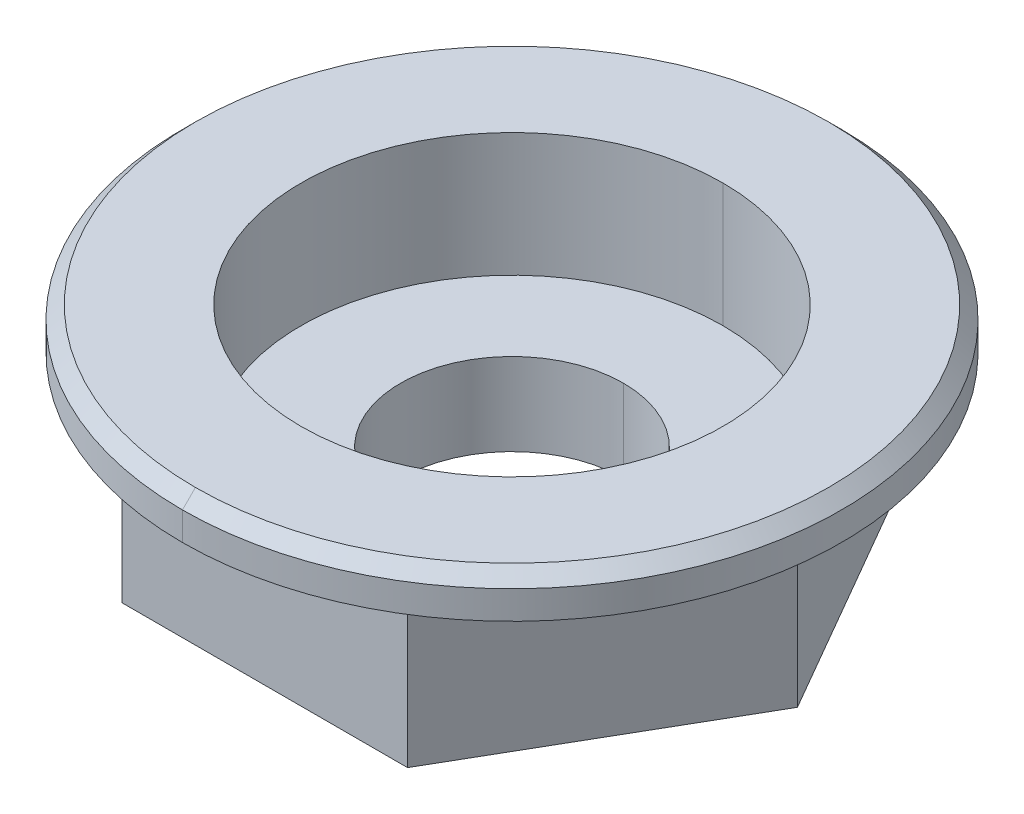
ISO-10303-21;
HEADER;
FILE_DESCRIPTION(('STEP AP214'),'2;1');
FILE_NAME('part.step','',(''),(''),'','','');
FILE_SCHEMA(('AUTOMOTIVE_DESIGN { 1 0 10303 214 1 1 1 1 }'));
ENDSEC;
DATA;
#1=APPLICATION_CONTEXT('core data for automotive mechanical design processes');
#2=APPLICATION_PROTOCOL_DEFINITION('international standard','automotive_design',2000,#1);
#3=PRODUCT_CONTEXT('',#1,'mechanical');
#4=PRODUCT('Part','Part','',(#3));
#5=PRODUCT_RELATED_PRODUCT_CATEGORY('part','',(#4));
#6=PRODUCT_DEFINITION_FORMATION('','',#4);
#7=PRODUCT_DEFINITION_CONTEXT('part definition',#1,'design');
#8=PRODUCT_DEFINITION('design','',#6,#7);
#9=PRODUCT_DEFINITION_SHAPE('','',#8);
#10=(LENGTH_UNIT() NAMED_UNIT(*) SI_UNIT(.MILLI.,.METRE.));
#11=(NAMED_UNIT(*) PLANE_ANGLE_UNIT() SI_UNIT($,.RADIAN.));
#12=(NAMED_UNIT(*) SI_UNIT($,.STERADIAN.) SOLID_ANGLE_UNIT());
#13=UNCERTAINTY_MEASURE_WITH_UNIT(LENGTH_MEASURE(1.E-05),#10,'distance_accuracy_value','');
#14=(GEOMETRIC_REPRESENTATION_CONTEXT(3) GLOBAL_UNCERTAINTY_ASSIGNED_CONTEXT((#13)) GLOBAL_UNIT_ASSIGNED_CONTEXT((#10,
#11,#12)) REPRESENTATION_CONTEXT('',''));
#15=CARTESIAN_POINT('',(0.,0.,0.));
#16=DIRECTION('',(0.,0.,1.));
#17=DIRECTION('',(1.,0.,0.));
#18=AXIS2_PLACEMENT_3D('',#15,#16,#17);
#19=CARTESIAN_POINT('',(0.,3.96875,0.));
#20=DIRECTION('',(0.,-1.,0.));
#21=DIRECTION('',(0.,0.,-1.));
#22=AXIS2_PLACEMENT_3D('',#19,#20,#21);
#23=CONICAL_SURFACE('',#22,6.1,0.785398163397446);
#24=DIRECTION('',(0.,-0.707106781186549,0.707106781186546));
#25=VECTOR('',#24,1.);
#26=CARTESIAN_POINT('',(0.,3.96875,6.1));
#27=LINE('',#26,#25);
#28=CARTESIAN_POINT('',(0.,3.96875,6.1));
#29=VERTEX_POINT('',#28);
#30=CARTESIAN_POINT('',(0.,3.71875,6.35));
#31=VERTEX_POINT('',#30);
#32=EDGE_CURVE('E206',#29,#31,#27,.T.);
#33=ORIENTED_EDGE('',*,*,#32,.F.);
#34=CARTESIAN_POINT('',(0.,3.96875,0.));
#35=DIRECTION('',(0.,1.,0.));
#36=DIRECTION('',(0.,0.,1.));
#37=AXIS2_PLACEMENT_3D('',#34,#35,#36);
#38=CIRCLE('',#37,6.1);
#39=CARTESIAN_POINT('',(0.,3.96875,-6.1));
#40=VERTEX_POINT('',#39);
#41=EDGE_CURVE('E228',#40,#29,#38,.T.);
#42=ORIENTED_EDGE('',*,*,#41,.F.);
#43=DIRECTION('',(0.,-0.707106781186549,-0.707106781186546));
#44=VECTOR('',#43,1.);
#45=CARTESIAN_POINT('',(0.,3.96875,-6.1));
#46=LINE('',#45,#44);
#47=CARTESIAN_POINT('',(0.,3.71875,-6.35));
#48=VERTEX_POINT('',#47);
#49=EDGE_CURVE('E244',#40,#48,#46,.T.);
#50=ORIENTED_EDGE('',*,*,#49,.T.);
#51=CARTESIAN_POINT('',(0.,3.71875,0.));
#52=DIRECTION('',(0.,-1.,0.));
#53=DIRECTION('',(0.,0.,1.));
#54=AXIS2_PLACEMENT_3D('',#51,#52,#53);
#55=CIRCLE('',#54,6.35);
#56=EDGE_CURVE('E247',#31,#48,#55,.T.);
#57=ORIENTED_EDGE('',*,*,#56,.F.);
#58=EDGE_LOOP('',(#33,#42,#50,#57));
#59=FACE_BOUND('',#58,.T.);
#60=ADVANCED_FACE('F16',(#59),#23,.T.);
#61=CARTESIAN_POINT('',(0.,0.,0.));
#62=DIRECTION('',(0.,1.,0.));
#63=DIRECTION('',(0.,0.,1.));
#64=AXIS2_PLACEMENT_3D('',#61,#62,#63);
#65=CYLINDRICAL_SURFACE('',#64,2.1463);
#66=DIRECTION('',(0.,1.,0.));
#67=VECTOR('',#66,1.);
#68=CARTESIAN_POINT('',(0.,0.,-2.1463));
#69=LINE('',#68,#67);
#70=CARTESIAN_POINT('',(0.,0.,-2.1463));
#71=VERTEX_POINT('',#70);
#72=CARTESIAN_POINT('',(0.,1.5875,-2.1463));
#73=VERTEX_POINT('',#72);
#74=EDGE_CURVE('E215',#71,#73,#69,.T.);
#75=ORIENTED_EDGE('',*,*,#74,.F.);
#76=CARTESIAN_POINT('',(0.,0.,0.));
#77=DIRECTION('',(0.,1.,0.));
#78=DIRECTION('',(0.,0.,1.));
#79=AXIS2_PLACEMENT_3D('',#76,#77,#78);
#80=CIRCLE('',#79,2.1463);
#81=CARTESIAN_POINT('',(0.,0.,2.1463));
#82=VERTEX_POINT('',#81);
#83=EDGE_CURVE('E216',#82,#71,#80,.T.);
#84=ORIENTED_EDGE('',*,*,#83,.F.);
#85=DIRECTION('',(0.,1.,0.));
#86=VECTOR('',#85,1.);
#87=CARTESIAN_POINT('',(0.,0.,2.1463));
#88=LINE('',#87,#86);
#89=CARTESIAN_POINT('',(0.,1.5875,2.1463));
#90=VERTEX_POINT('',#89);
#91=EDGE_CURVE('E201',#82,#90,#88,.T.);
#92=ORIENTED_EDGE('',*,*,#91,.T.);
#93=CARTESIAN_POINT('',(0.,1.5875,0.));
#94=DIRECTION('',(0.,1.,0.));
#95=DIRECTION('',(0.,0.,1.));
#96=AXIS2_PLACEMENT_3D('',#93,#94,#95);
#97=CIRCLE('',#96,2.1463);
#98=EDGE_CURVE('E11',#90,#73,#97,.T.);
#99=ORIENTED_EDGE('',*,*,#98,.T.);
#100=EDGE_LOOP('',(#75,#84,#92,#99));
#101=FACE_BOUND('',#100,.T.);
#102=ADVANCED_FACE('F436',(#101),#65,.F.);
#103=CARTESIAN_POINT('',(0.,1.5875,0.));
#104=DIRECTION('',(0.,1.,0.));
#105=DIRECTION('',(1.,0.,0.));
#106=AXIS2_PLACEMENT_3D('',#103,#104,#105);
#107=PLANE('',#106);
#108=ORIENTED_EDGE('',*,*,#98,.F.);
#109=CARTESIAN_POINT('',(0.,1.5875,0.));
#110=DIRECTION('',(0.,1.,0.));
#111=DIRECTION('',(0.,0.,1.));
#112=AXIS2_PLACEMENT_3D('',#109,#110,#111);
#113=CIRCLE('',#112,2.1463);
#114=EDGE_CURVE('E205',#73,#90,#113,.T.);
#115=ORIENTED_EDGE('',*,*,#114,.F.);
#116=EDGE_LOOP('',(#108,#115));
#117=FACE_BOUND('',#116,.T.);
#118=CARTESIAN_POINT('',(0.,1.5875,0.));
#119=DIRECTION('',(0.,-1.,0.));
#120=DIRECTION('',(0.,0.,1.));
#121=AXIS2_PLACEMENT_3D('',#118,#119,#120);
#122=CIRCLE('',#121,4.064);
#123=CARTESIAN_POINT('',(0.,1.5875,4.064));
#124=VERTEX_POINT('',#123);
#125=CARTESIAN_POINT('',(0.,1.5875,-4.064));
#126=VERTEX_POINT('',#125);
#127=EDGE_CURVE('E204',#124,#126,#122,.T.);
#128=ORIENTED_EDGE('',*,*,#127,.F.);
#129=CARTESIAN_POINT('',(0.,1.5875,0.));
#130=DIRECTION('',(0.,-1.,0.));
#131=DIRECTION('',(0.,0.,1.));
#132=AXIS2_PLACEMENT_3D('',#129,#130,#131);
#133=CIRCLE('',#132,4.064);
#134=EDGE_CURVE('E27',#126,#124,#133,.T.);
#135=ORIENTED_EDGE('',*,*,#134,.F.);
#136=EDGE_LOOP('',(#128,#135));
#137=FACE_BOUND('',#136,.T.);
#138=ADVANCED_FACE('F18',(#117,#137),#107,.T.);
#139=CARTESIAN_POINT('',(0.,-11.4947278349685,0.));
#140=DIRECTION('',(0.,1.,0.));
#141=DIRECTION('',(0.,0.,1.));
#142=AXIS2_PLACEMENT_3D('',#139,#140,#141);
#143=CYLINDRICAL_SURFACE('',#142,4.064);
#144=DIRECTION('',(0.,1.,0.));
#145=VECTOR('',#144,1.);
#146=CARTESIAN_POINT('',(0.,-11.4947278349685,-4.064));
#147=LINE('',#146,#145);
#148=CARTESIAN_POINT('',(0.,3.96875,-4.064));
#149=VERTEX_POINT('',#148);
#150=EDGE_CURVE('E271',#126,#149,#147,.T.);
#151=ORIENTED_EDGE('',*,*,#150,.F.);
#152=ORIENTED_EDGE('',*,*,#134,.T.);
#153=DIRECTION('',(0.,1.,0.));
#154=VECTOR('',#153,1.);
#155=CARTESIAN_POINT('',(0.,-11.4947278349685,4.064));
#156=LINE('',#155,#154);
#157=CARTESIAN_POINT('',(0.,3.96875,4.064));
#158=VERTEX_POINT('',#157);
#159=EDGE_CURVE('E255',#124,#158,#156,.T.);
#160=ORIENTED_EDGE('',*,*,#159,.T.);
#161=CARTESIAN_POINT('',(0.,3.96875,0.));
#162=DIRECTION('',(0.,1.,0.));
#163=DIRECTION('',(0.,0.,1.));
#164=AXIS2_PLACEMENT_3D('',#161,#162,#163);
#165=CIRCLE('',#164,4.064);
#166=EDGE_CURVE('E225',#158,#149,#165,.T.);
#167=ORIENTED_EDGE('',*,*,#166,.T.);
#168=EDGE_LOOP('',(#151,#152,#160,#167));
#169=FACE_BOUND('',#168,.T.);
#170=ADVANCED_FACE('F283',(#169),#143,.F.);
#171=CARTESIAN_POINT('',(0.,3.96875,0.));
#172=DIRECTION('',(0.,1.,0.));
#173=DIRECTION('',(1.,0.,0.));
#174=AXIS2_PLACEMENT_3D('',#171,#172,#173);
#175=PLANE('',#174);
#176=ORIENTED_EDGE('',*,*,#166,.F.);
#177=CARTESIAN_POINT('',(0.,3.96875,0.));
#178=DIRECTION('',(0.,1.,0.));
#179=DIRECTION('',(0.,0.,1.));
#180=AXIS2_PLACEMENT_3D('',#177,#178,#179);
#181=CIRCLE('',#180,4.064);
#182=EDGE_CURVE('E259',#149,#158,#181,.T.);
#183=ORIENTED_EDGE('',*,*,#182,.F.);
#184=EDGE_LOOP('',(#176,#183));
#185=FACE_BOUND('',#184,.T.);
#186=ORIENTED_EDGE('',*,*,#41,.T.);
#187=CARTESIAN_POINT('',(0.,3.96875,0.));
#188=DIRECTION('',(0.,1.,0.));
#189=DIRECTION('',(0.,0.,1.));
#190=AXIS2_PLACEMENT_3D('',#187,#188,#189);
#191=CIRCLE('',#190,6.1);
#192=EDGE_CURVE('E211',#29,#40,#191,.T.);
#193=ORIENTED_EDGE('',*,*,#192,.T.);
#194=EDGE_LOOP('',(#186,#193));
#195=FACE_BOUND('',#194,.T.);
#196=ADVANCED_FACE('F373',(#185,#195),#175,.T.);
#197=CARTESIAN_POINT('',(0.,3.96875,0.));
#198=DIRECTION('',(0.,-1.,0.));
#199=DIRECTION('',(0.,0.,-1.));
#200=AXIS2_PLACEMENT_3D('',#197,#198,#199);
#201=CYLINDRICAL_SURFACE('',#200,6.35);
#202=DIRECTION('',(0.,-1.,0.));
#203=VECTOR('',#202,1.);
#204=CARTESIAN_POINT('',(0.,3.96875,6.35));
#205=LINE('',#204,#203);
#206=CARTESIAN_POINT('',(0.,3.175,6.35));
#207=VERTEX_POINT('',#206);
#208=EDGE_CURVE('E199',#31,#207,#205,.T.);
#209=ORIENTED_EDGE('',*,*,#208,.F.);
#210=ORIENTED_EDGE('',*,*,#56,.T.);
#211=DIRECTION('',(0.,-1.,0.));
#212=VECTOR('',#211,1.);
#213=CARTESIAN_POINT('',(0.,3.96875,-6.35));
#214=LINE('',#213,#212);
#215=CARTESIAN_POINT('',(0.,3.175,-6.35));
#216=VERTEX_POINT('',#215);
#217=EDGE_CURVE('E188',#48,#216,#214,.T.);
#218=ORIENTED_EDGE('',*,*,#217,.T.);
#219=CARTESIAN_POINT('',(0.,3.175,0.));
#220=DIRECTION('',(0.,1.,0.));
#221=DIRECTION('',(0.,0.,1.));
#222=AXIS2_PLACEMENT_3D('',#219,#220,#221);
#223=CIRCLE('',#222,6.35);
#224=EDGE_CURVE('E220',#216,#207,#223,.T.);
#225=ORIENTED_EDGE('',*,*,#224,.T.);
#226=EDGE_LOOP('',(#209,#210,#218,#225));
#227=FACE_BOUND('',#226,.T.);
#228=ADVANCED_FACE('F367',(#227),#201,.T.);
#229=CARTESIAN_POINT('',(0.,3.175,0.));
#230=DIRECTION('',(0.,1.,0.));
#231=DIRECTION('',(1.,0.,0.));
#232=AXIS2_PLACEMENT_3D('',#229,#230,#231);
#233=PLANE('',#232);
#234=DIRECTION('',(1.,0.,0.));
#235=VECTOR('',#234,1.);
#236=CARTESIAN_POINT('',(-2.74963065701554,3.175,4.7625));
#237=LINE('',#236,#235);
#238=CARTESIAN_POINT('',(-2.74963065701554,3.175,4.7625));
#239=VERTEX_POINT('',#238);
#240=CARTESIAN_POINT('',(2.74963065701564,3.175,4.7625));
#241=VERTEX_POINT('',#240);
#242=EDGE_CURVE('E42',#239,#241,#237,.T.);
#243=ORIENTED_EDGE('',*,*,#242,.T.);
#244=DIRECTION('',(0.5,0.,-0.866025403784442));
#245=VECTOR('',#244,1.);
#246=CARTESIAN_POINT('',(2.74963065701564,3.175,4.7625));
#247=LINE('',#246,#245);
#248=CARTESIAN_POINT('',(5.49926131403117,3.175,0.));
#249=VERTEX_POINT('',#248);
#250=EDGE_CURVE('E184',#241,#249,#247,.T.);
#251=ORIENTED_EDGE('',*,*,#250,.T.);
#252=DIRECTION('',(-0.5,0.,-0.866025403784438));
#253=VECTOR('',#252,1.);
#254=CARTESIAN_POINT('',(5.49926131403117,3.175,0.));
#255=LINE('',#254,#253);
#256=CARTESIAN_POINT('',(2.74963065701558,3.175,-4.7625));
#257=VERTEX_POINT('',#256);
#258=EDGE_CURVE('E179',#249,#257,#255,.T.);
#259=ORIENTED_EDGE('',*,*,#258,.T.);
#260=DIRECTION('',(-1.,0.,0.));
#261=VECTOR('',#260,1.);
#262=CARTESIAN_POINT('',(2.74963065701558,3.175,-4.7625));
#263=LINE('',#262,#261);
#264=CARTESIAN_POINT('',(-2.7496306570156,3.175,-4.7625));
#265=VERTEX_POINT('',#264);
#266=EDGE_CURVE('E130',#257,#265,#263,.T.);
#267=ORIENTED_EDGE('',*,*,#266,.T.);
#268=DIRECTION('',(-0.5,0.,0.866025403784442));
#269=VECTOR('',#268,1.);
#270=CARTESIAN_POINT('',(-2.7496306570156,3.175,-4.7625));
#271=LINE('',#270,#269);
#272=CARTESIAN_POINT('',(-5.49926131403117,3.175,0.));
#273=VERTEX_POINT('',#272);
#274=EDGE_CURVE('E145',#265,#273,#271,.T.);
#275=ORIENTED_EDGE('',*,*,#274,.T.);
#276=DIRECTION('',(0.500000000000007,0.,0.866025403784435));
#277=VECTOR('',#276,1.);
#278=CARTESIAN_POINT('',(-5.49926131403117,3.175,0.));
#279=LINE('',#278,#277);
#280=EDGE_CURVE('E224',#273,#239,#279,.T.);
#281=ORIENTED_EDGE('',*,*,#280,.T.);
#282=EDGE_LOOP('',(#243,#251,#259,#267,#275,#281));
#283=FACE_BOUND('',#282,.T.);
#284=ORIENTED_EDGE('',*,*,#224,.F.);
#285=CARTESIAN_POINT('',(0.,3.175,0.));
#286=DIRECTION('',(0.,1.,0.));
#287=DIRECTION('',(0.,0.,1.));
#288=AXIS2_PLACEMENT_3D('',#285,#286,#287);
#289=CIRCLE('',#288,6.35);
#290=EDGE_CURVE('E195',#207,#216,#289,.T.);
#291=ORIENTED_EDGE('',*,*,#290,.F.);
#292=EDGE_LOOP('',(#284,#291));
#293=FACE_BOUND('',#292,.T.);
#294=ADVANCED_FACE('F372',(#283,#293),#233,.F.);
#295=CARTESIAN_POINT('',(0.,0.,0.));
#296=DIRECTION('',(0.,1.,0.));
#297=DIRECTION('',(1.,0.,0.));
#298=AXIS2_PLACEMENT_3D('',#295,#296,#297);
#299=PLANE('',#298);
#300=ORIENTED_EDGE('',*,*,#83,.T.);
#301=CARTESIAN_POINT('',(0.,0.,0.));
#302=DIRECTION('',(0.,1.,0.));
#303=DIRECTION('',(0.,0.,1.));
#304=AXIS2_PLACEMENT_3D('',#301,#302,#303);
#305=CIRCLE('',#304,2.1463);
#306=EDGE_CURVE('E240',#71,#82,#305,.T.);
#307=ORIENTED_EDGE('',*,*,#306,.T.);
#308=EDGE_LOOP('',(#300,#307));
#309=FACE_BOUND('',#308,.T.);
#310=DIRECTION('',(0.5,0.,-0.866025403784442));
#311=VECTOR('',#310,1.);
#312=CARTESIAN_POINT('',(2.74963065701564,0.,4.7625));
#313=LINE('',#312,#311);
#314=CARTESIAN_POINT('',(2.74963065701564,0.,4.7625));
#315=VERTEX_POINT('',#314);
#316=CARTESIAN_POINT('',(5.49926131403117,0.,0.));
#317=VERTEX_POINT('',#316);
#318=EDGE_CURVE('E170',#315,#317,#313,.T.);
#319=ORIENTED_EDGE('',*,*,#318,.F.);
#320=DIRECTION('',(1.,0.,0.));
#321=VECTOR('',#320,1.);
#322=CARTESIAN_POINT('',(-2.74963065701554,0.,4.7625));
#323=LINE('',#322,#321);
#324=CARTESIAN_POINT('',(-2.74963065701554,0.,4.7625));
#325=VERTEX_POINT('',#324);
#326=EDGE_CURVE('E221',#325,#315,#323,.T.);
#327=ORIENTED_EDGE('',*,*,#326,.F.);
#328=DIRECTION('',(0.500000000000007,0.,0.866025403784435));
#329=VECTOR('',#328,1.);
#330=CARTESIAN_POINT('',(-5.49926131403117,0.,0.));
#331=LINE('',#330,#329);
#332=CARTESIAN_POINT('',(-5.49926131403117,0.,0.));
#333=VERTEX_POINT('',#332);
#334=EDGE_CURVE('E153',#333,#325,#331,.T.);
#335=ORIENTED_EDGE('',*,*,#334,.F.);
#336=DIRECTION('',(-0.5,0.,0.866025403784442));
#337=VECTOR('',#336,1.);
#338=CARTESIAN_POINT('',(-2.7496306570156,0.,-4.7625));
#339=LINE('',#338,#337);
#340=CARTESIAN_POINT('',(-2.7496306570156,0.,-4.7625));
#341=VERTEX_POINT('',#340);
#342=EDGE_CURVE('E235',#341,#333,#339,.T.);
#343=ORIENTED_EDGE('',*,*,#342,.F.);
#344=DIRECTION('',(-1.,0.,0.));
#345=VECTOR('',#344,1.);
#346=CARTESIAN_POINT('',(2.74963065701558,0.,-4.7625));
#347=LINE('',#346,#345);
#348=CARTESIAN_POINT('',(2.74963065701558,0.,-4.7625));
#349=VERTEX_POINT('',#348);
#350=EDGE_CURVE('E117',#349,#341,#347,.T.);
#351=ORIENTED_EDGE('',*,*,#350,.F.);
#352=DIRECTION('',(-0.5,0.,-0.866025403784438));
#353=VECTOR('',#352,1.);
#354=CARTESIAN_POINT('',(5.49926131403117,0.,0.));
#355=LINE('',#354,#353);
#356=EDGE_CURVE('E166',#317,#349,#355,.T.);
#357=ORIENTED_EDGE('',*,*,#356,.F.);
#358=EDGE_LOOP('',(#319,#327,#335,#343,#351,#357));
#359=FACE_BOUND('',#358,.T.);
#360=ADVANCED_FACE('F168',(#309,#359),#299,.F.);
#361=CARTESIAN_POINT('',(-2.74963065701554,3.175,4.7625));
#362=DIRECTION('',(0.,0.,-1.));
#363=DIRECTION('',(-1.,0.,0.));
#364=AXIS2_PLACEMENT_3D('',#361,#362,#363);
#365=PLANE('',#364);
#366=ORIENTED_EDGE('',*,*,#326,.T.);
#367=DIRECTION('',(0.,-1.,0.));
#368=VECTOR('',#367,1.);
#369=CARTESIAN_POINT('',(2.74963065701564,3.175,4.7625));
#370=LINE('',#369,#368);
#371=EDGE_CURVE('E175',#241,#315,#370,.T.);
#372=ORIENTED_EDGE('',*,*,#371,.F.);
#373=ORIENTED_EDGE('',*,*,#242,.F.);
#374=DIRECTION('',(0.,-1.,0.));
#375=VECTOR('',#374,1.);
#376=CARTESIAN_POINT('',(-2.74963065701554,3.175,4.7625));
#377=LINE('',#376,#375);
#378=EDGE_CURVE('E302',#239,#325,#377,.T.);
#379=ORIENTED_EDGE('',*,*,#378,.T.);
#380=EDGE_LOOP('',(#366,#372,#373,#379));
#381=FACE_BOUND('',#380,.T.);
#382=ADVANCED_FACE('F417',(#381),#365,.F.);
#383=CARTESIAN_POINT('',(-5.49926131403117,3.175,0.));
#384=DIRECTION('',(0.866025403784435,0.,-0.500000000000007));
#385=DIRECTION('',(0.,-1.,0.));
#386=AXIS2_PLACEMENT_3D('',#383,#384,#385);
#387=PLANE('',#386);
#388=ORIENTED_EDGE('',*,*,#334,.T.);
#389=ORIENTED_EDGE('',*,*,#378,.F.);
#390=ORIENTED_EDGE('',*,*,#280,.F.);
#391=DIRECTION('',(0.,-1.,0.));
#392=VECTOR('',#391,1.);
#393=CARTESIAN_POINT('',(-5.49926131403117,3.175,0.));
#394=LINE('',#393,#392);
#395=EDGE_CURVE('E232',#273,#333,#394,.T.);
#396=ORIENTED_EDGE('',*,*,#395,.T.);
#397=EDGE_LOOP('',(#388,#389,#390,#396));
#398=FACE_BOUND('',#397,.T.);
#399=ADVANCED_FACE('F411',(#398),#387,.F.);
#400=CARTESIAN_POINT('',(-2.7496306570156,3.175,-4.7625));
#401=DIRECTION('',(0.866025403784442,0.,0.5));
#402=DIRECTION('',(0.,-1.,0.));
#403=AXIS2_PLACEMENT_3D('',#400,#401,#402);
#404=PLANE('',#403);
#405=ORIENTED_EDGE('',*,*,#342,.T.);
#406=ORIENTED_EDGE('',*,*,#395,.F.);
#407=ORIENTED_EDGE('',*,*,#274,.F.);
#408=DIRECTION('',(0.,-1.,0.));
#409=VECTOR('',#408,1.);
#410=CARTESIAN_POINT('',(-2.7496306570156,3.175,-4.7625));
#411=LINE('',#410,#409);
#412=EDGE_CURVE('E229',#265,#341,#411,.T.);
#413=ORIENTED_EDGE('',*,*,#412,.T.);
#414=EDGE_LOOP('',(#405,#406,#407,#413));
#415=FACE_BOUND('',#414,.T.);
#416=ADVANCED_FACE('F416',(#415),#404,.F.);
#417=CARTESIAN_POINT('',(2.74963065701558,3.175,-4.7625));
#418=DIRECTION('',(0.,0.,1.));
#419=DIRECTION('',(1.,0.,0.));
#420=AXIS2_PLACEMENT_3D('',#417,#418,#419);
#421=PLANE('',#420);
#422=ORIENTED_EDGE('',*,*,#350,.T.);
#423=ORIENTED_EDGE('',*,*,#412,.F.);
#424=ORIENTED_EDGE('',*,*,#266,.F.);
#425=DIRECTION('',(0.,-1.,0.));
#426=VECTOR('',#425,1.);
#427=CARTESIAN_POINT('',(2.74963065701558,3.175,-4.7625));
#428=LINE('',#427,#426);
#429=EDGE_CURVE('E174',#257,#349,#428,.T.);
#430=ORIENTED_EDGE('',*,*,#429,.T.);
#431=EDGE_LOOP('',(#422,#423,#424,#430));
#432=FACE_BOUND('',#431,.T.);
#433=ADVANCED_FACE('F386',(#432),#421,.F.);
#434=CARTESIAN_POINT('',(5.49926131403117,3.175,0.));
#435=DIRECTION('',(-0.866025403784438,0.,0.5));
#436=DIRECTION('',(0.,1.,0.));
#437=AXIS2_PLACEMENT_3D('',#434,#435,#436);
#438=PLANE('',#437);
#439=ORIENTED_EDGE('',*,*,#356,.T.);
#440=ORIENTED_EDGE('',*,*,#429,.F.);
#441=ORIENTED_EDGE('',*,*,#258,.F.);
#442=DIRECTION('',(0.,-1.,0.));
#443=VECTOR('',#442,1.);
#444=CARTESIAN_POINT('',(5.49926131403117,3.175,0.));
#445=LINE('',#444,#443);
#446=EDGE_CURVE('E20',#249,#317,#445,.T.);
#447=ORIENTED_EDGE('',*,*,#446,.T.);
#448=EDGE_LOOP('',(#439,#440,#441,#447));
#449=FACE_BOUND('',#448,.T.);
#450=ADVANCED_FACE('F178',(#449),#438,.F.);
#451=CARTESIAN_POINT('',(2.74963065701564,3.175,4.7625));
#452=DIRECTION('',(-0.866025403784442,0.,-0.5));
#453=DIRECTION('',(-0.5,0.,0.866025403784442));
#454=AXIS2_PLACEMENT_3D('',#451,#452,#453);
#455=PLANE('',#454);
#456=ORIENTED_EDGE('',*,*,#318,.T.);
#457=ORIENTED_EDGE('',*,*,#446,.F.);
#458=ORIENTED_EDGE('',*,*,#250,.F.);
#459=ORIENTED_EDGE('',*,*,#371,.T.);
#460=EDGE_LOOP('',(#456,#457,#458,#459));
#461=FACE_BOUND('',#460,.T.);
#462=ADVANCED_FACE('F186',(#461),#455,.F.);
#463=CARTESIAN_POINT('',(0.,3.96875,0.));
#464=DIRECTION('',(0.,-1.,0.));
#465=DIRECTION('',(0.,0.,-1.));
#466=AXIS2_PLACEMENT_3D('',#463,#464,#465);
#467=CYLINDRICAL_SURFACE('',#466,6.35);
#468=CARTESIAN_POINT('',(0.,3.71875,0.));
#469=DIRECTION('',(0.,-1.,0.));
#470=DIRECTION('',(0.,0.,1.));
#471=AXIS2_PLACEMENT_3D('',#468,#469,#470);
#472=CIRCLE('',#471,6.35);
#473=EDGE_CURVE('E210',#48,#31,#472,.T.);
#474=ORIENTED_EDGE('',*,*,#473,.T.);
#475=ORIENTED_EDGE('',*,*,#208,.T.);
#476=ORIENTED_EDGE('',*,*,#290,.T.);
#477=ORIENTED_EDGE('',*,*,#217,.F.);
#478=EDGE_LOOP('',(#474,#475,#476,#477));
#479=FACE_BOUND('',#478,.T.);
#480=ADVANCED_FACE('F355',(#479),#467,.T.);
#481=CARTESIAN_POINT('',(0.,-11.4947278349685,0.));
#482=DIRECTION('',(0.,1.,0.));
#483=DIRECTION('',(0.,0.,1.));
#484=AXIS2_PLACEMENT_3D('',#481,#482,#483);
#485=CYLINDRICAL_SURFACE('',#484,4.064);
#486=ORIENTED_EDGE('',*,*,#127,.T.);
#487=ORIENTED_EDGE('',*,*,#150,.T.);
#488=ORIENTED_EDGE('',*,*,#182,.T.);
#489=ORIENTED_EDGE('',*,*,#159,.F.);
#490=EDGE_LOOP('',(#486,#487,#488,#489));
#491=FACE_BOUND('',#490,.T.);
#492=ADVANCED_FACE('F289',(#491),#485,.F.);
#493=CARTESIAN_POINT('',(0.,0.,0.));
#494=DIRECTION('',(0.,1.,0.));
#495=DIRECTION('',(0.,0.,1.));
#496=AXIS2_PLACEMENT_3D('',#493,#494,#495);
#497=CYLINDRICAL_SURFACE('',#496,2.1463);
#498=ORIENTED_EDGE('',*,*,#306,.F.);
#499=ORIENTED_EDGE('',*,*,#74,.T.);
#500=ORIENTED_EDGE('',*,*,#114,.T.);
#501=ORIENTED_EDGE('',*,*,#91,.F.);
#502=EDGE_LOOP('',(#498,#499,#500,#501));
#503=FACE_BOUND('',#502,.T.);
#504=ADVANCED_FACE('F341',(#503),#497,.F.);
#505=CARTESIAN_POINT('',(0.,3.96875,0.));
#506=DIRECTION('',(0.,-1.,0.));
#507=DIRECTION('',(0.,0.,-1.));
#508=AXIS2_PLACEMENT_3D('',#505,#506,#507);
#509=CONICAL_SURFACE('',#508,6.1,0.785398163397446);
#510=ORIENTED_EDGE('',*,*,#192,.F.);
#511=ORIENTED_EDGE('',*,*,#32,.T.);
#512=ORIENTED_EDGE('',*,*,#473,.F.);
#513=ORIENTED_EDGE('',*,*,#49,.F.);
#514=EDGE_LOOP('',(#510,#511,#512,#513));
#515=FACE_BOUND('',#514,.T.);
#516=ADVANCED_FACE('F346',(#515),#509,.T.);
#517=CLOSED_SHELL('',(#60,#102,#138,#170,#196,#228,#294,#360,#382,#399,#416,#433,#450,#462,#480,
#492,#504,#516));
#518=MANIFOLD_SOLID_BREP('B1',#517);
#519=ADVANCED_BREP_SHAPE_REPRESENTATION('',(#18,#518),#14);
#520=SHAPE_DEFINITION_REPRESENTATION(#9,#519);
ENDSEC;
END-ISO-10303-21;
